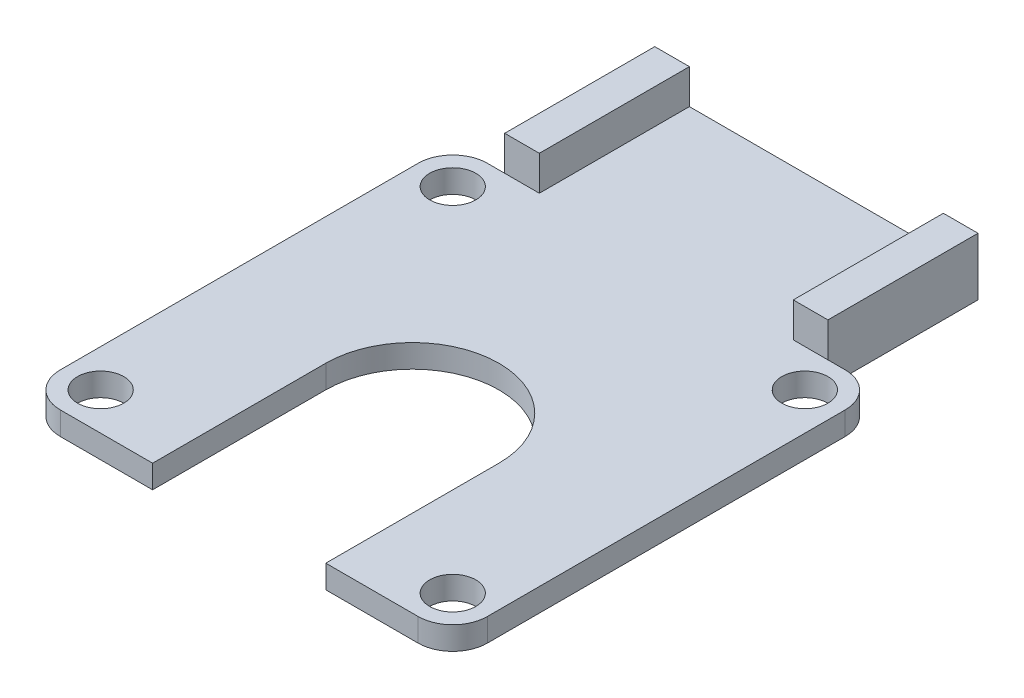
ISO-10303-21;
HEADER;
FILE_DESCRIPTION(('STEP AP214'),'2;1');
FILE_NAME('part.step','',(''),(''),'','','');
FILE_SCHEMA(('AUTOMOTIVE_DESIGN { 1 0 10303 214 1 1 1 1 }'));
ENDSEC;
DATA;
#1=APPLICATION_CONTEXT('core data for automotive mechanical design processes');
#2=APPLICATION_PROTOCOL_DEFINITION('international standard','automotive_design',2000,#1);
#3=PRODUCT_CONTEXT('',#1,'mechanical');
#4=PRODUCT('Part','Part','',(#3));
#5=PRODUCT_RELATED_PRODUCT_CATEGORY('part','',(#4));
#6=PRODUCT_DEFINITION_FORMATION('','',#4);
#7=PRODUCT_DEFINITION_CONTEXT('part definition',#1,'design');
#8=PRODUCT_DEFINITION('design','',#6,#7);
#9=PRODUCT_DEFINITION_SHAPE('','',#8);
#10=(LENGTH_UNIT() NAMED_UNIT(*) SI_UNIT(.MILLI.,.METRE.));
#11=(NAMED_UNIT(*) PLANE_ANGLE_UNIT() SI_UNIT($,.RADIAN.));
#12=(NAMED_UNIT(*) SI_UNIT($,.STERADIAN.) SOLID_ANGLE_UNIT());
#13=UNCERTAINTY_MEASURE_WITH_UNIT(LENGTH_MEASURE(1.E-05),#10,'distance_accuracy_value','');
#14=(GEOMETRIC_REPRESENTATION_CONTEXT(3) GLOBAL_UNCERTAINTY_ASSIGNED_CONTEXT((#13)) GLOBAL_UNIT_ASSIGNED_CONTEXT((#10,
#11,#12)) REPRESENTATION_CONTEXT('',''));
#15=CARTESIAN_POINT('',(0.,0.,0.));
#16=DIRECTION('',(0.,0.,1.));
#17=DIRECTION('',(1.,0.,0.));
#18=AXIS2_PLACEMENT_3D('',#15,#16,#17);
#19=CARTESIAN_POINT('',(0.,2.,0.));
#20=DIRECTION('',(0.,1.,0.));
#21=DIRECTION('',(0.,0.,1.));
#22=AXIS2_PLACEMENT_3D('',#19,#20,#21);
#23=PLANE('',#22);
#24=CARTESIAN_POINT('',(-15.25,2.,-15.25));
#25=DIRECTION('',(0.,1.,0.));
#26=DIRECTION('',(0.,0.,1.));
#27=AXIS2_PLACEMENT_3D('',#24,#25,#26);
#28=CIRCLE('',#27,2.);
#29=CARTESIAN_POINT('',(-15.25,2.,-13.25));
#30=VERTEX_POINT('',#29);
#31=EDGE_CURVE('E271',#30,#30,#28,.T.);
#32=ORIENTED_EDGE('',*,*,#31,.F.);
#33=EDGE_LOOP('',(#32));
#34=FACE_BOUND('',#33,.T.);
#35=CARTESIAN_POINT('',(15.25,2.,15.25));
#36=DIRECTION('',(0.,1.,0.));
#37=DIRECTION('',(0.,0.,1.));
#38=AXIS2_PLACEMENT_3D('',#35,#36,#37);
#39=CIRCLE('',#38,2.);
#40=CARTESIAN_POINT('',(15.25,2.,17.25));
#41=VERTEX_POINT('',#40);
#42=EDGE_CURVE('E283',#41,#41,#39,.T.);
#43=ORIENTED_EDGE('',*,*,#42,.F.);
#44=EDGE_LOOP('',(#43));
#45=FACE_BOUND('',#44,.T.);
#46=CARTESIAN_POINT('',(15.25,2.,-15.25));
#47=DIRECTION('',(0.,1.,0.));
#48=DIRECTION('',(0.,0.,1.));
#49=AXIS2_PLACEMENT_3D('',#46,#47,#48);
#50=CIRCLE('',#49,2.);
#51=CARTESIAN_POINT('',(15.25,2.,-13.25));
#52=VERTEX_POINT('',#51);
#53=EDGE_CURVE('E289',#52,#52,#50,.T.);
#54=ORIENTED_EDGE('',*,*,#53,.F.);
#55=EDGE_LOOP('',(#54));
#56=FACE_BOUND('',#55,.T.);
#57=CARTESIAN_POINT('',(-15.25,2.,15.25));
#58=DIRECTION('',(0.,1.,0.));
#59=DIRECTION('',(0.,0.,1.));
#60=AXIS2_PLACEMENT_3D('',#57,#58,#59);
#61=CIRCLE('',#60,2.);
#62=CARTESIAN_POINT('',(-15.25,2.,17.25));
#63=VERTEX_POINT('',#62);
#64=EDGE_CURVE('E295',#63,#63,#61,.T.);
#65=ORIENTED_EDGE('',*,*,#64,.F.);
#66=EDGE_LOOP('',(#65));
#67=FACE_BOUND('',#66,.T.);
#68=CARTESIAN_POINT('',(0.,2.,3.5));
#69=DIRECTION('',(0.,1.,0.));
#70=DIRECTION('',(0.,0.,1.));
#71=AXIS2_PLACEMENT_3D('',#68,#69,#70);
#72=CIRCLE('',#71,7.5);
#73=CARTESIAN_POINT('',(7.5,2.,3.5));
#74=VERTEX_POINT('',#73);
#75=CARTESIAN_POINT('',(-7.5,2.,3.5));
#76=VERTEX_POINT('',#75);
#77=EDGE_CURVE('E184',#74,#76,#72,.T.);
#78=ORIENTED_EDGE('',*,*,#77,.F.);
#79=DIRECTION('',(0.,0.,1.));
#80=VECTOR('',#79,1.);
#81=CARTESIAN_POINT('',(7.5,2.,0.));
#82=LINE('',#81,#80);
#83=CARTESIAN_POINT('',(7.5,2.,18.5));
#84=VERTEX_POINT('',#83);
#85=EDGE_CURVE('E196',#74,#84,#82,.T.);
#86=ORIENTED_EDGE('',*,*,#85,.T.);
#87=DIRECTION('',(1.,0.,0.));
#88=VECTOR('',#87,1.);
#89=CARTESIAN_POINT('',(18.5,2.,18.5));
#90=LINE('',#89,#88);
#91=CARTESIAN_POINT('',(15.5,2.,18.5));
#92=VERTEX_POINT('',#91);
#93=EDGE_CURVE('E305',#84,#92,#90,.T.);
#94=ORIENTED_EDGE('',*,*,#93,.T.);
#95=CARTESIAN_POINT('',(15.5,2.,15.5));
#96=DIRECTION('',(0.,1.,0.));
#97=DIRECTION('',(0.,0.,1.));
#98=AXIS2_PLACEMENT_3D('',#95,#96,#97);
#99=CIRCLE('',#98,3.);
#100=CARTESIAN_POINT('',(18.5,2.,15.5));
#101=VERTEX_POINT('',#100);
#102=EDGE_CURVE('E349',#92,#101,#99,.T.);
#103=ORIENTED_EDGE('',*,*,#102,.T.);
#104=DIRECTION('',(0.,0.,-1.));
#105=VECTOR('',#104,1.);
#106=CARTESIAN_POINT('',(18.5,2.,18.5));
#107=LINE('',#106,#105);
#108=CARTESIAN_POINT('',(18.5,2.,-15.5));
#109=VERTEX_POINT('',#108);
#110=EDGE_CURVE('E310',#101,#109,#107,.T.);
#111=ORIENTED_EDGE('',*,*,#110,.T.);
#112=CARTESIAN_POINT('',(15.5,2.,-15.5));
#113=DIRECTION('',(0.,1.,0.));
#114=DIRECTION('',(0.,0.,1.));
#115=AXIS2_PLACEMENT_3D('',#112,#113,#114);
#116=CIRCLE('',#115,3.);
#117=CARTESIAN_POINT('',(15.5,2.,-18.5));
#118=VERTEX_POINT('',#117);
#119=EDGE_CURVE('E351',#109,#118,#116,.T.);
#120=ORIENTED_EDGE('',*,*,#119,.T.);
#121=DIRECTION('',(-1.,0.,0.));
#122=VECTOR('',#121,1.);
#123=CARTESIAN_POINT('',(18.5,2.,-18.5));
#124=LINE('',#123,#122);
#125=CARTESIAN_POINT('',(14.,2.,-18.5));
#126=VERTEX_POINT('',#125);
#127=EDGE_CURVE('E314',#118,#126,#124,.T.);
#128=ORIENTED_EDGE('',*,*,#127,.T.);
#129=DIRECTION('',(1.,0.,0.));
#130=VECTOR('',#129,1.);
#131=CARTESIAN_POINT('',(14.,2.,-18.5));
#132=LINE('',#131,#130);
#133=CARTESIAN_POINT('',(11.,2.,-18.5));
#134=VERTEX_POINT('',#133);
#135=EDGE_CURVE('E56',#134,#126,#132,.T.);
#136=ORIENTED_EDGE('',*,*,#135,.F.);
#137=DIRECTION('',(0.,0.,1.));
#138=VECTOR('',#137,1.);
#139=CARTESIAN_POINT('',(11.,2.,-31.5));
#140=LINE('',#139,#138);
#141=CARTESIAN_POINT('',(11.,2.,-31.5));
#142=VERTEX_POINT('',#141);
#143=EDGE_CURVE('E207',#142,#134,#140,.T.);
#144=ORIENTED_EDGE('',*,*,#143,.F.);
#145=DIRECTION('',(-1.,0.,0.));
#146=VECTOR('',#145,1.);
#147=CARTESIAN_POINT('',(14.,2.,-31.5));
#148=LINE('',#147,#146);
#149=CARTESIAN_POINT('',(-11.,2.,-31.5));
#150=VERTEX_POINT('',#149);
#151=EDGE_CURVE('E257',#142,#150,#148,.T.);
#152=ORIENTED_EDGE('',*,*,#151,.T.);
#153=DIRECTION('',(0.,0.,-1.));
#154=VECTOR('',#153,1.);
#155=CARTESIAN_POINT('',(-11.,2.,-31.5));
#156=LINE('',#155,#154);
#157=CARTESIAN_POINT('',(-11.,2.,-18.5));
#158=VERTEX_POINT('',#157);
#159=EDGE_CURVE('E237',#158,#150,#156,.T.);
#160=ORIENTED_EDGE('',*,*,#159,.F.);
#161=DIRECTION('',(1.,0.,0.));
#162=VECTOR('',#161,1.);
#163=CARTESIAN_POINT('',(-14.,2.,-18.5));
#164=LINE('',#163,#162);
#165=CARTESIAN_POINT('',(-14.,2.,-18.5));
#166=VERTEX_POINT('',#165);
#167=EDGE_CURVE('E232',#166,#158,#164,.T.);
#168=ORIENTED_EDGE('',*,*,#167,.F.);
#169=CARTESIAN_POINT('',(-15.5,2.,-18.5));
#170=VERTEX_POINT('',#169);
#171=EDGE_CURVE('E313',#166,#170,#124,.T.);
#172=ORIENTED_EDGE('',*,*,#171,.T.);
#173=CARTESIAN_POINT('',(-15.5,2.,-15.5));
#174=DIRECTION('',(0.,1.,0.));
#175=DIRECTION('',(0.,0.,1.));
#176=AXIS2_PLACEMENT_3D('',#173,#174,#175);
#177=CIRCLE('',#176,3.);
#178=CARTESIAN_POINT('',(-18.5,2.,-15.5));
#179=VERTEX_POINT('',#178);
#180=EDGE_CURVE('E353',#170,#179,#177,.T.);
#181=ORIENTED_EDGE('',*,*,#180,.T.);
#182=DIRECTION('',(0.,0.,1.));
#183=VECTOR('',#182,1.);
#184=CARTESIAN_POINT('',(-18.5,2.,18.5));
#185=LINE('',#184,#183);
#186=CARTESIAN_POINT('',(-18.5,2.,15.5));
#187=VERTEX_POINT('',#186);
#188=EDGE_CURVE('E302',#179,#187,#185,.T.);
#189=ORIENTED_EDGE('',*,*,#188,.T.);
#190=CARTESIAN_POINT('',(-15.5,2.,15.5));
#191=DIRECTION('',(0.,1.,0.));
#192=DIRECTION('',(0.,0.,1.));
#193=AXIS2_PLACEMENT_3D('',#190,#191,#192);
#194=CIRCLE('',#193,3.);
#195=CARTESIAN_POINT('',(-15.5,2.,18.5));
#196=VERTEX_POINT('',#195);
#197=EDGE_CURVE('E347',#187,#196,#194,.T.);
#198=ORIENTED_EDGE('',*,*,#197,.T.);
#199=CARTESIAN_POINT('',(-7.5,2.,18.5));
#200=VERTEX_POINT('',#199);
#201=EDGE_CURVE('E307',#196,#200,#90,.T.);
#202=ORIENTED_EDGE('',*,*,#201,.T.);
#203=DIRECTION('',(0.,0.,1.));
#204=VECTOR('',#203,1.);
#205=CARTESIAN_POINT('',(-7.50000000000001,2.,0.));
#206=LINE('',#205,#204);
#207=EDGE_CURVE('E199',#76,#200,#206,.T.);
#208=ORIENTED_EDGE('',*,*,#207,.F.);
#209=EDGE_LOOP('',(#78,#86,#94,#103,#111,#120,#128,#136,#144,#152,#160,#168,#172,#181,#189,#198,
#202,#208));
#210=FACE_BOUND('',#209,.T.);
#211=ADVANCED_FACE('F33',(#34,#45,#56,#67,#210),#23,.T.);
#212=CARTESIAN_POINT('',(18.5,2.,18.5));
#213=DIRECTION('',(0.,0.,-1.));
#214=DIRECTION('',(-1.,0.,0.));
#215=AXIS2_PLACEMENT_3D('',#212,#213,#214);
#216=PLANE('',#215);
#217=DIRECTION('',(0.,1.,0.));
#218=VECTOR('',#217,1.);
#219=CARTESIAN_POINT('',(7.5,0.,18.5));
#220=LINE('',#219,#218);
#221=CARTESIAN_POINT('',(7.5,0.,18.5));
#222=VERTEX_POINT('',#221);
#223=EDGE_CURVE('E208',#222,#84,#220,.T.);
#224=ORIENTED_EDGE('',*,*,#223,.F.);
#225=DIRECTION('',(1.,0.,0.));
#226=VECTOR('',#225,1.);
#227=CARTESIAN_POINT('',(18.5,0.,18.5));
#228=LINE('',#227,#226);
#229=CARTESIAN_POINT('',(15.5,0.,18.5));
#230=VERTEX_POINT('',#229);
#231=EDGE_CURVE('E319',#222,#230,#228,.T.);
#232=ORIENTED_EDGE('',*,*,#231,.T.);
#233=DIRECTION('',(0.,-1.,0.));
#234=VECTOR('',#233,1.);
#235=CARTESIAN_POINT('',(15.5,2.,18.5));
#236=LINE('',#235,#234);
#237=EDGE_CURVE('E11',#230,#92,#236,.F.);
#238=ORIENTED_EDGE('',*,*,#237,.T.);
#239=ORIENTED_EDGE('',*,*,#93,.F.);
#240=EDGE_LOOP('',(#224,#232,#238,#239));
#241=FACE_BOUND('',#240,.T.);
#242=ADVANCED_FACE('F431',(#241),#216,.F.);
#243=CARTESIAN_POINT('',(0.,0.,0.));
#244=DIRECTION('',(0.,1.,0.));
#245=DIRECTION('',(0.,0.,1.));
#246=AXIS2_PLACEMENT_3D('',#243,#244,#245);
#247=PLANE('',#246);
#248=CARTESIAN_POINT('',(-15.25,0.,15.25));
#249=DIRECTION('',(0.,1.,0.));
#250=DIRECTION('',(0.,0.,1.));
#251=AXIS2_PLACEMENT_3D('',#248,#249,#250);
#252=CIRCLE('',#251,2.);
#253=CARTESIAN_POINT('',(-15.25,0.,17.25));
#254=VERTEX_POINT('',#253);
#255=EDGE_CURVE('E298',#254,#254,#252,.T.);
#256=ORIENTED_EDGE('',*,*,#255,.T.);
#257=EDGE_LOOP('',(#256));
#258=FACE_BOUND('',#257,.T.);
#259=CARTESIAN_POINT('',(15.25,0.,-15.25));
#260=DIRECTION('',(0.,1.,0.));
#261=DIRECTION('',(0.,0.,1.));
#262=AXIS2_PLACEMENT_3D('',#259,#260,#261);
#263=CIRCLE('',#262,2.);
#264=CARTESIAN_POINT('',(15.25,0.,-13.25));
#265=VERTEX_POINT('',#264);
#266=EDGE_CURVE('E292',#265,#265,#263,.T.);
#267=ORIENTED_EDGE('',*,*,#266,.T.);
#268=EDGE_LOOP('',(#267));
#269=FACE_BOUND('',#268,.T.);
#270=CARTESIAN_POINT('',(15.25,0.,15.25));
#271=DIRECTION('',(0.,1.,0.));
#272=DIRECTION('',(0.,0.,1.));
#273=AXIS2_PLACEMENT_3D('',#270,#271,#272);
#274=CIRCLE('',#273,2.);
#275=CARTESIAN_POINT('',(15.25,0.,17.25));
#276=VERTEX_POINT('',#275);
#277=EDGE_CURVE('E286',#276,#276,#274,.T.);
#278=ORIENTED_EDGE('',*,*,#277,.T.);
#279=EDGE_LOOP('',(#278));
#280=FACE_BOUND('',#279,.T.);
#281=CARTESIAN_POINT('',(-15.25,0.,-15.25));
#282=DIRECTION('',(0.,1.,0.));
#283=DIRECTION('',(0.,0.,1.));
#284=AXIS2_PLACEMENT_3D('',#281,#282,#283);
#285=CIRCLE('',#284,2.);
#286=CARTESIAN_POINT('',(-15.25,0.,-13.25));
#287=VERTEX_POINT('',#286);
#288=EDGE_CURVE('E280',#287,#287,#285,.T.);
#289=ORIENTED_EDGE('',*,*,#288,.T.);
#290=EDGE_LOOP('',(#289));
#291=FACE_BOUND('',#290,.T.);
#292=DIRECTION('',(0.,0.,1.));
#293=VECTOR('',#292,1.);
#294=CARTESIAN_POINT('',(7.5,0.,0.));
#295=LINE('',#294,#293);
#296=CARTESIAN_POINT('',(7.5,0.,3.5));
#297=VERTEX_POINT('',#296);
#298=EDGE_CURVE('E186',#297,#222,#295,.T.);
#299=ORIENTED_EDGE('',*,*,#298,.F.);
#300=CARTESIAN_POINT('',(0.,0.,3.5));
#301=DIRECTION('',(0.,1.,0.));
#302=DIRECTION('',(0.,0.,1.));
#303=AXIS2_PLACEMENT_3D('',#300,#301,#302);
#304=CIRCLE('',#303,7.5);
#305=CARTESIAN_POINT('',(-7.5,0.,3.5));
#306=VERTEX_POINT('',#305);
#307=EDGE_CURVE('E181',#297,#306,#304,.T.);
#308=ORIENTED_EDGE('',*,*,#307,.T.);
#309=DIRECTION('',(0.,0.,1.));
#310=VECTOR('',#309,1.);
#311=CARTESIAN_POINT('',(-7.50000000000001,0.,0.));
#312=LINE('',#311,#310);
#313=CARTESIAN_POINT('',(-7.5,0.,18.5));
#314=VERTEX_POINT('',#313);
#315=EDGE_CURVE('E188',#306,#314,#312,.T.);
#316=ORIENTED_EDGE('',*,*,#315,.T.);
#317=CARTESIAN_POINT('',(-15.5,0.,18.5));
#318=VERTEX_POINT('',#317);
#319=EDGE_CURVE('E320',#318,#314,#228,.T.);
#320=ORIENTED_EDGE('',*,*,#319,.F.);
#321=CARTESIAN_POINT('',(-15.5,0.,15.5));
#322=DIRECTION('',(0.,1.,0.));
#323=DIRECTION('',(0.,0.,1.));
#324=AXIS2_PLACEMENT_3D('',#321,#322,#323);
#325=CIRCLE('',#324,3.);
#326=CARTESIAN_POINT('',(-18.5,0.,15.5));
#327=VERTEX_POINT('',#326);
#328=EDGE_CURVE('E331',#318,#327,#325,.F.);
#329=ORIENTED_EDGE('',*,*,#328,.T.);
#330=DIRECTION('',(0.,0.,1.));
#331=VECTOR('',#330,1.);
#332=CARTESIAN_POINT('',(-18.5,0.,18.5));
#333=LINE('',#332,#331);
#334=CARTESIAN_POINT('',(-18.5,0.,-15.5));
#335=VERTEX_POINT('',#334);
#336=EDGE_CURVE('E301',#335,#327,#333,.T.);
#337=ORIENTED_EDGE('',*,*,#336,.F.);
#338=CARTESIAN_POINT('',(-15.5,0.,-15.5));
#339=DIRECTION('',(0.,1.,0.));
#340=DIRECTION('',(0.,0.,1.));
#341=AXIS2_PLACEMENT_3D('',#338,#339,#340);
#342=CIRCLE('',#341,3.);
#343=CARTESIAN_POINT('',(-15.5,0.,-18.5));
#344=VERTEX_POINT('',#343);
#345=EDGE_CURVE('E338',#335,#344,#342,.F.);
#346=ORIENTED_EDGE('',*,*,#345,.T.);
#347=DIRECTION('',(-1.,0.,0.));
#348=VECTOR('',#347,1.);
#349=CARTESIAN_POINT('',(18.5,0.,-18.5));
#350=LINE('',#349,#348);
#351=CARTESIAN_POINT('',(-14.,0.,-18.5));
#352=VERTEX_POINT('',#351);
#353=EDGE_CURVE('E325',#352,#344,#350,.T.);
#354=ORIENTED_EDGE('',*,*,#353,.F.);
#355=DIRECTION('',(0.,0.,1.));
#356=VECTOR('',#355,1.);
#357=CARTESIAN_POINT('',(-14.,0.,-18.5));
#358=LINE('',#357,#356);
#359=CARTESIAN_POINT('',(-14.,0.,-31.5));
#360=VERTEX_POINT('',#359);
#361=EDGE_CURVE('E258',#360,#352,#358,.T.);
#362=ORIENTED_EDGE('',*,*,#361,.F.);
#363=DIRECTION('',(-1.,0.,0.));
#364=VECTOR('',#363,1.);
#365=CARTESIAN_POINT('',(14.,0.,-31.5));
#366=LINE('',#365,#364);
#367=CARTESIAN_POINT('',(14.,0.,-31.5));
#368=VERTEX_POINT('',#367);
#369=EDGE_CURVE('E264',#368,#360,#366,.T.);
#370=ORIENTED_EDGE('',*,*,#369,.F.);
#371=DIRECTION('',(0.,0.,-1.));
#372=VECTOR('',#371,1.);
#373=CARTESIAN_POINT('',(14.,0.,-18.5));
#374=LINE('',#373,#372);
#375=CARTESIAN_POINT('',(14.,0.,-18.5));
#376=VERTEX_POINT('',#375);
#377=EDGE_CURVE('E261',#376,#368,#374,.T.);
#378=ORIENTED_EDGE('',*,*,#377,.F.);
#379=CARTESIAN_POINT('',(15.5,0.,-18.5));
#380=VERTEX_POINT('',#379);
#381=EDGE_CURVE('E306',#380,#376,#350,.T.);
#382=ORIENTED_EDGE('',*,*,#381,.F.);
#383=CARTESIAN_POINT('',(15.5,0.,-15.5));
#384=DIRECTION('',(0.,1.,0.));
#385=DIRECTION('',(0.,0.,1.));
#386=AXIS2_PLACEMENT_3D('',#383,#384,#385);
#387=CIRCLE('',#386,3.);
#388=CARTESIAN_POINT('',(18.5,0.,-15.5));
#389=VERTEX_POINT('',#388);
#390=EDGE_CURVE('E336',#380,#389,#387,.F.);
#391=ORIENTED_EDGE('',*,*,#390,.T.);
#392=DIRECTION('',(0.,0.,-1.));
#393=VECTOR('',#392,1.);
#394=CARTESIAN_POINT('',(18.5,0.,18.5));
#395=LINE('',#394,#393);
#396=CARTESIAN_POINT('',(18.5,0.,15.5));
#397=VERTEX_POINT('',#396);
#398=EDGE_CURVE('E322',#397,#389,#395,.T.);
#399=ORIENTED_EDGE('',*,*,#398,.F.);
#400=CARTESIAN_POINT('',(15.5,0.,15.5));
#401=DIRECTION('',(0.,1.,0.));
#402=DIRECTION('',(0.,0.,1.));
#403=AXIS2_PLACEMENT_3D('',#400,#401,#402);
#404=CIRCLE('',#403,3.);
#405=EDGE_CURVE('E333',#397,#230,#404,.F.);
#406=ORIENTED_EDGE('',*,*,#405,.T.);
#407=ORIENTED_EDGE('',*,*,#231,.F.);
#408=EDGE_LOOP('',(#299,#308,#316,#320,#329,#337,#346,#354,#362,#370,#378,#382,#391,#399,#406,#407));
#409=FACE_BOUND('',#408,.T.);
#410=ADVANCED_FACE('F194',(#258,#269,#280,#291,#409),#247,.F.);
#411=CARTESIAN_POINT('',(18.5,2.,-18.5));
#412=DIRECTION('',(0.,0.,1.));
#413=DIRECTION('',(1.,0.,0.));
#414=AXIS2_PLACEMENT_3D('',#411,#412,#413);
#415=PLANE('',#414);
#416=ORIENTED_EDGE('',*,*,#171,.F.);
#417=DIRECTION('',(0.,1.,0.));
#418=VECTOR('',#417,1.);
#419=CARTESIAN_POINT('',(-14.,0.,-18.5));
#420=LINE('',#419,#418);
#421=EDGE_CURVE('E267',#352,#166,#420,.T.);
#422=ORIENTED_EDGE('',*,*,#421,.F.);
#423=ORIENTED_EDGE('',*,*,#353,.T.);
#424=DIRECTION('',(0.,-1.,0.));
#425=VECTOR('',#424,1.);
#426=CARTESIAN_POINT('',(-15.5,2.,-18.5));
#427=LINE('',#426,#425);
#428=EDGE_CURVE('E344',#344,#170,#427,.F.);
#429=ORIENTED_EDGE('',*,*,#428,.T.);
#430=EDGE_LOOP('',(#416,#422,#423,#429));
#431=FACE_BOUND('',#430,.T.);
#432=ADVANCED_FACE('F381',(#431),#415,.F.);
#433=CARTESIAN_POINT('',(-18.5,2.,18.5));
#434=DIRECTION('',(1.,0.,0.));
#435=DIRECTION('',(0.,0.,-1.));
#436=AXIS2_PLACEMENT_3D('',#433,#434,#435);
#437=PLANE('',#436);
#438=ORIENTED_EDGE('',*,*,#188,.F.);
#439=DIRECTION('',(0.,-1.,0.));
#440=VECTOR('',#439,1.);
#441=CARTESIAN_POINT('',(-18.5,2.,-15.5));
#442=LINE('',#441,#440);
#443=EDGE_CURVE('E328',#179,#335,#442,.T.);
#444=ORIENTED_EDGE('',*,*,#443,.T.);
#445=ORIENTED_EDGE('',*,*,#336,.T.);
#446=DIRECTION('',(0.,-1.,0.));
#447=VECTOR('',#446,1.);
#448=CARTESIAN_POINT('',(-18.5,2.,15.5));
#449=LINE('',#448,#447);
#450=EDGE_CURVE('E316',#327,#187,#449,.F.);
#451=ORIENTED_EDGE('',*,*,#450,.T.);
#452=EDGE_LOOP('',(#438,#444,#445,#451));
#453=FACE_BOUND('',#452,.T.);
#454=ADVANCED_FACE('F370',(#453),#437,.F.);
#455=ORIENTED_EDGE('',*,*,#319,.T.);
#456=DIRECTION('',(0.,1.,0.));
#457=VECTOR('',#456,1.);
#458=CARTESIAN_POINT('',(-7.5,0.,18.5));
#459=LINE('',#458,#457);
#460=EDGE_CURVE('E48',#314,#200,#459,.T.);
#461=ORIENTED_EDGE('',*,*,#460,.T.);
#462=ORIENTED_EDGE('',*,*,#201,.F.);
#463=DIRECTION('',(0.,-1.,0.));
#464=VECTOR('',#463,1.);
#465=CARTESIAN_POINT('',(-15.5,2.,18.5));
#466=LINE('',#465,#464);
#467=EDGE_CURVE('E41',#196,#318,#466,.T.);
#468=ORIENTED_EDGE('',*,*,#467,.T.);
#469=EDGE_LOOP('',(#455,#461,#462,#468));
#470=FACE_BOUND('',#469,.T.);
#471=ADVANCED_FACE('F363',(#470),#216,.F.);
#472=CARTESIAN_POINT('',(18.5,2.,18.5));
#473=DIRECTION('',(-1.,0.,0.));
#474=DIRECTION('',(0.,0.,1.));
#475=AXIS2_PLACEMENT_3D('',#472,#473,#474);
#476=PLANE('',#475);
#477=ORIENTED_EDGE('',*,*,#398,.T.);
#478=DIRECTION('',(0.,-1.,0.));
#479=VECTOR('',#478,1.);
#480=CARTESIAN_POINT('',(18.5,2.,-15.5));
#481=LINE('',#480,#479);
#482=EDGE_CURVE('E358',#389,#109,#481,.F.);
#483=ORIENTED_EDGE('',*,*,#482,.T.);
#484=ORIENTED_EDGE('',*,*,#110,.F.);
#485=DIRECTION('',(0.,-1.,0.));
#486=VECTOR('',#485,1.);
#487=CARTESIAN_POINT('',(18.5,2.,15.5));
#488=LINE('',#487,#486);
#489=EDGE_CURVE('E355',#101,#397,#488,.T.);
#490=ORIENTED_EDGE('',*,*,#489,.T.);
#491=EDGE_LOOP('',(#477,#483,#484,#490));
#492=FACE_BOUND('',#491,.T.);
#493=ADVANCED_FACE('F422',(#492),#476,.F.);
#494=ORIENTED_EDGE('',*,*,#381,.T.);
#495=DIRECTION('',(0.,1.,0.));
#496=VECTOR('',#495,1.);
#497=CARTESIAN_POINT('',(14.,0.,-18.5));
#498=LINE('',#497,#496);
#499=EDGE_CURVE('E274',#376,#126,#498,.T.);
#500=ORIENTED_EDGE('',*,*,#499,.T.);
#501=ORIENTED_EDGE('',*,*,#127,.F.);
#502=DIRECTION('',(0.,-1.,0.));
#503=VECTOR('',#502,1.);
#504=CARTESIAN_POINT('',(15.5,2.,-18.5));
#505=LINE('',#504,#503);
#506=EDGE_CURVE('E341',#118,#380,#505,.T.);
#507=ORIENTED_EDGE('',*,*,#506,.T.);
#508=EDGE_LOOP('',(#494,#500,#501,#507));
#509=FACE_BOUND('',#508,.T.);
#510=ADVANCED_FACE('F413',(#509),#415,.F.);
#511=CARTESIAN_POINT('',(-15.5,2.,-15.5));
#512=DIRECTION('',(0.,-1.,0.));
#513=DIRECTION('',(0.,0.,-1.));
#514=AXIS2_PLACEMENT_3D('',#511,#512,#513);
#515=CYLINDRICAL_SURFACE('',#514,3.);
#516=ORIENTED_EDGE('',*,*,#180,.F.);
#517=ORIENTED_EDGE('',*,*,#428,.F.);
#518=ORIENTED_EDGE('',*,*,#345,.F.);
#519=ORIENTED_EDGE('',*,*,#443,.F.);
#520=EDGE_LOOP('',(#516,#517,#518,#519));
#521=FACE_BOUND('',#520,.T.);
#522=ADVANCED_FACE('F374',(#521),#515,.T.);
#523=CARTESIAN_POINT('',(15.5,2.,-15.5));
#524=DIRECTION('',(0.,-1.,0.));
#525=DIRECTION('',(0.,0.,-1.));
#526=AXIS2_PLACEMENT_3D('',#523,#524,#525);
#527=CYLINDRICAL_SURFACE('',#526,3.);
#528=ORIENTED_EDGE('',*,*,#119,.F.);
#529=ORIENTED_EDGE('',*,*,#482,.F.);
#530=ORIENTED_EDGE('',*,*,#390,.F.);
#531=ORIENTED_EDGE('',*,*,#506,.F.);
#532=EDGE_LOOP('',(#528,#529,#530,#531));
#533=FACE_BOUND('',#532,.T.);
#534=ADVANCED_FACE('F418',(#533),#527,.T.);
#535=CARTESIAN_POINT('',(15.5,2.,15.5));
#536=DIRECTION('',(0.,-1.,0.));
#537=DIRECTION('',(0.,0.,-1.));
#538=AXIS2_PLACEMENT_3D('',#535,#536,#537);
#539=CYLINDRICAL_SURFACE('',#538,3.);
#540=ORIENTED_EDGE('',*,*,#102,.F.);
#541=ORIENTED_EDGE('',*,*,#237,.F.);
#542=ORIENTED_EDGE('',*,*,#405,.F.);
#543=ORIENTED_EDGE('',*,*,#489,.F.);
#544=EDGE_LOOP('',(#540,#541,#542,#543));
#545=FACE_BOUND('',#544,.T.);
#546=ADVANCED_FACE('F428',(#545),#539,.T.);
#547=CARTESIAN_POINT('',(-15.5,2.,15.5));
#548=DIRECTION('',(0.,-1.,0.));
#549=DIRECTION('',(0.,0.,-1.));
#550=AXIS2_PLACEMENT_3D('',#547,#548,#549);
#551=CYLINDRICAL_SURFACE('',#550,3.);
#552=ORIENTED_EDGE('',*,*,#197,.F.);
#553=ORIENTED_EDGE('',*,*,#450,.F.);
#554=ORIENTED_EDGE('',*,*,#328,.F.);
#555=ORIENTED_EDGE('',*,*,#467,.F.);
#556=EDGE_LOOP('',(#552,#553,#554,#555));
#557=FACE_BOUND('',#556,.T.);
#558=ADVANCED_FACE('F35',(#557),#551,.T.);
#559=CARTESIAN_POINT('',(-15.25,2.,15.25));
#560=DIRECTION('',(0.,1.,0.));
#561=DIRECTION('',(0.,0.,1.));
#562=AXIS2_PLACEMENT_3D('',#559,#560,#561);
#563=CYLINDRICAL_SURFACE('',#562,2.);
#564=ORIENTED_EDGE('',*,*,#255,.F.);
#565=EDGE_LOOP('',(#564));
#566=FACE_BOUND('',#565,.T.);
#567=ORIENTED_EDGE('',*,*,#64,.T.);
#568=EDGE_LOOP('',(#567));
#569=FACE_BOUND('',#568,.T.);
#570=ADVANCED_FACE('F455',(#566,#569),#563,.F.);
#571=CARTESIAN_POINT('',(15.25,2.,-15.25));
#572=DIRECTION('',(0.,1.,0.));
#573=DIRECTION('',(0.,0.,1.));
#574=AXIS2_PLACEMENT_3D('',#571,#572,#573);
#575=CYLINDRICAL_SURFACE('',#574,2.);
#576=ORIENTED_EDGE('',*,*,#266,.F.);
#577=EDGE_LOOP('',(#576));
#578=FACE_BOUND('',#577,.T.);
#579=ORIENTED_EDGE('',*,*,#53,.T.);
#580=EDGE_LOOP('',(#579));
#581=FACE_BOUND('',#580,.T.);
#582=ADVANCED_FACE('F477',(#578,#581),#575,.F.);
#583=CARTESIAN_POINT('',(15.25,2.,15.25));
#584=DIRECTION('',(0.,1.,0.));
#585=DIRECTION('',(0.,0.,1.));
#586=AXIS2_PLACEMENT_3D('',#583,#584,#585);
#587=CYLINDRICAL_SURFACE('',#586,2.);
#588=ORIENTED_EDGE('',*,*,#277,.F.);
#589=EDGE_LOOP('',(#588));
#590=FACE_BOUND('',#589,.T.);
#591=ORIENTED_EDGE('',*,*,#42,.T.);
#592=EDGE_LOOP('',(#591));
#593=FACE_BOUND('',#592,.T.);
#594=ADVANCED_FACE('F482',(#590,#593),#587,.F.);
#595=CARTESIAN_POINT('',(-15.25,2.,-15.25));
#596=DIRECTION('',(0.,1.,0.));
#597=DIRECTION('',(0.,0.,1.));
#598=AXIS2_PLACEMENT_3D('',#595,#596,#597);
#599=CYLINDRICAL_SURFACE('',#598,2.);
#600=ORIENTED_EDGE('',*,*,#288,.F.);
#601=EDGE_LOOP('',(#600));
#602=FACE_BOUND('',#601,.T.);
#603=ORIENTED_EDGE('',*,*,#31,.T.);
#604=EDGE_LOOP('',(#603));
#605=FACE_BOUND('',#604,.T.);
#606=ADVANCED_FACE('F495',(#602,#605),#599,.F.);
#607=CARTESIAN_POINT('',(-14.,0.,-18.5));
#608=DIRECTION('',(-1.,0.,0.));
#609=DIRECTION('',(0.,0.,1.));
#610=AXIS2_PLACEMENT_3D('',#607,#608,#609);
#611=PLANE('',#610);
#612=ORIENTED_EDGE('',*,*,#421,.T.);
#613=DIRECTION('',(0.,-1.,0.));
#614=VECTOR('',#613,1.);
#615=CARTESIAN_POINT('',(-14.,5.,-18.5));
#616=LINE('',#615,#614);
#617=CARTESIAN_POINT('',(-14.,5.,-18.5));
#618=VERTEX_POINT('',#617);
#619=EDGE_CURVE('E254',#618,#166,#616,.T.);
#620=ORIENTED_EDGE('',*,*,#619,.F.);
#621=DIRECTION('',(0.,0.,1.));
#622=VECTOR('',#621,1.);
#623=CARTESIAN_POINT('',(-14.,5.,-31.5));
#624=LINE('',#623,#622);
#625=CARTESIAN_POINT('',(-14.,5.,-31.5));
#626=VERTEX_POINT('',#625);
#627=EDGE_CURVE('E233',#626,#618,#624,.T.);
#628=ORIENTED_EDGE('',*,*,#627,.F.);
#629=DIRECTION('',(0.,1.,0.));
#630=VECTOR('',#629,1.);
#631=CARTESIAN_POINT('',(-14.,0.,-31.5));
#632=LINE('',#631,#630);
#633=EDGE_CURVE('E269',#360,#626,#632,.T.);
#634=ORIENTED_EDGE('',*,*,#633,.F.);
#635=ORIENTED_EDGE('',*,*,#361,.T.);
#636=EDGE_LOOP('',(#612,#620,#628,#634,#635));
#637=FACE_BOUND('',#636,.T.);
#638=ADVANCED_FACE('F384',(#637),#611,.T.);
#639=CARTESIAN_POINT('',(14.,0.,-31.5));
#640=DIRECTION('',(0.,0.,-1.));
#641=DIRECTION('',(-1.,0.,0.));
#642=AXIS2_PLACEMENT_3D('',#639,#640,#641);
#643=PLANE('',#642);
#644=ORIENTED_EDGE('',*,*,#151,.F.);
#645=DIRECTION('',(0.,-1.,0.));
#646=VECTOR('',#645,1.);
#647=CARTESIAN_POINT('',(11.,5.,-31.5));
#648=LINE('',#647,#646);
#649=CARTESIAN_POINT('',(11.,5.,-31.5));
#650=VERTEX_POINT('',#649);
#651=EDGE_CURVE('E229',#650,#142,#648,.T.);
#652=ORIENTED_EDGE('',*,*,#651,.F.);
#653=DIRECTION('',(-1.,0.,0.));
#654=VECTOR('',#653,1.);
#655=CARTESIAN_POINT('',(14.,5.,-31.5));
#656=LINE('',#655,#654);
#657=CARTESIAN_POINT('',(14.,5.,-31.5));
#658=VERTEX_POINT('',#657);
#659=EDGE_CURVE('E211',#658,#650,#656,.T.);
#660=ORIENTED_EDGE('',*,*,#659,.F.);
#661=DIRECTION('',(0.,1.,0.));
#662=VECTOR('',#661,1.);
#663=CARTESIAN_POINT('',(14.,0.,-31.5));
#664=LINE('',#663,#662);
#665=EDGE_CURVE('E272',#368,#658,#664,.T.);
#666=ORIENTED_EDGE('',*,*,#665,.F.);
#667=ORIENTED_EDGE('',*,*,#369,.T.);
#668=ORIENTED_EDGE('',*,*,#633,.T.);
#669=DIRECTION('',(-1.,0.,0.));
#670=VECTOR('',#669,1.);
#671=CARTESIAN_POINT('',(-14.,5.,-31.5));
#672=LINE('',#671,#670);
#673=CARTESIAN_POINT('',(-11.,5.,-31.5));
#674=VERTEX_POINT('',#673);
#675=EDGE_CURVE('E241',#674,#626,#672,.T.);
#676=ORIENTED_EDGE('',*,*,#675,.F.);
#677=DIRECTION('',(0.,-1.,0.));
#678=VECTOR('',#677,1.);
#679=CARTESIAN_POINT('',(-11.,5.,-31.5));
#680=LINE('',#679,#678);
#681=EDGE_CURVE('E244',#674,#150,#680,.T.);
#682=ORIENTED_EDGE('',*,*,#681,.T.);
#683=EDGE_LOOP('',(#644,#652,#660,#666,#667,#668,#676,#682));
#684=FACE_BOUND('',#683,.T.);
#685=ADVANCED_FACE('F389',(#684),#643,.T.);
#686=CARTESIAN_POINT('',(14.,0.,-18.5));
#687=DIRECTION('',(1.,0.,0.));
#688=DIRECTION('',(0.,0.,-1.));
#689=AXIS2_PLACEMENT_3D('',#686,#687,#688);
#690=PLANE('',#689);
#691=ORIENTED_EDGE('',*,*,#665,.T.);
#692=DIRECTION('',(0.,0.,-1.));
#693=VECTOR('',#692,1.);
#694=CARTESIAN_POINT('',(14.,5.,-31.5));
#695=LINE('',#694,#693);
#696=CARTESIAN_POINT('',(14.,5.,-18.5));
#697=VERTEX_POINT('',#696);
#698=EDGE_CURVE('E218',#697,#658,#695,.T.);
#699=ORIENTED_EDGE('',*,*,#698,.F.);
#700=DIRECTION('',(0.,-1.,0.));
#701=VECTOR('',#700,1.);
#702=CARTESIAN_POINT('',(14.,5.,-18.5));
#703=LINE('',#702,#701);
#704=EDGE_CURVE('E221',#697,#126,#703,.T.);
#705=ORIENTED_EDGE('',*,*,#704,.T.);
#706=ORIENTED_EDGE('',*,*,#499,.F.);
#707=ORIENTED_EDGE('',*,*,#377,.T.);
#708=EDGE_LOOP('',(#691,#699,#705,#706,#707));
#709=FACE_BOUND('',#708,.T.);
#710=ADVANCED_FACE('F409',(#709),#690,.T.);
#711=CARTESIAN_POINT('',(-14.,5.,-18.5));
#712=DIRECTION('',(0.,0.,-1.));
#713=DIRECTION('',(-1.,0.,0.));
#714=AXIS2_PLACEMENT_3D('',#711,#712,#713);
#715=PLANE('',#714);
#716=ORIENTED_EDGE('',*,*,#167,.T.);
#717=DIRECTION('',(0.,-1.,0.));
#718=VECTOR('',#717,1.);
#719=CARTESIAN_POINT('',(-11.,5.,-18.5));
#720=LINE('',#719,#718);
#721=CARTESIAN_POINT('',(-11.,5.,-18.5));
#722=VERTEX_POINT('',#721);
#723=EDGE_CURVE('E251',#722,#158,#720,.T.);
#724=ORIENTED_EDGE('',*,*,#723,.F.);
#725=DIRECTION('',(1.,0.,0.));
#726=VECTOR('',#725,1.);
#727=CARTESIAN_POINT('',(-14.,5.,-18.5));
#728=LINE('',#727,#726);
#729=EDGE_CURVE('E236',#618,#722,#728,.T.);
#730=ORIENTED_EDGE('',*,*,#729,.F.);
#731=ORIENTED_EDGE('',*,*,#619,.T.);
#732=EDGE_LOOP('',(#716,#724,#730,#731));
#733=FACE_BOUND('',#732,.T.);
#734=ADVANCED_FACE('F510',(#733),#715,.F.);
#735=CARTESIAN_POINT('',(-11.,5.,-31.5));
#736=DIRECTION('',(-1.,0.,0.));
#737=DIRECTION('',(0.,0.,1.));
#738=AXIS2_PLACEMENT_3D('',#735,#736,#737);
#739=PLANE('',#738);
#740=ORIENTED_EDGE('',*,*,#159,.T.);
#741=ORIENTED_EDGE('',*,*,#681,.F.);
#742=DIRECTION('',(0.,0.,-1.));
#743=VECTOR('',#742,1.);
#744=CARTESIAN_POINT('',(-11.,5.,-31.5));
#745=LINE('',#744,#743);
#746=EDGE_CURVE('E239',#722,#674,#745,.T.);
#747=ORIENTED_EDGE('',*,*,#746,.F.);
#748=ORIENTED_EDGE('',*,*,#723,.T.);
#749=EDGE_LOOP('',(#740,#741,#747,#748));
#750=FACE_BOUND('',#749,.T.);
#751=ADVANCED_FACE('F396',(#750),#739,.F.);
#752=CARTESIAN_POINT('',(0.,5.,0.));
#753=DIRECTION('',(0.,1.,0.));
#754=DIRECTION('',(0.,0.,1.));
#755=AXIS2_PLACEMENT_3D('',#752,#753,#754);
#756=PLANE('',#755);
#757=ORIENTED_EDGE('',*,*,#627,.T.);
#758=ORIENTED_EDGE('',*,*,#729,.T.);
#759=ORIENTED_EDGE('',*,*,#746,.T.);
#760=ORIENTED_EDGE('',*,*,#675,.T.);
#761=EDGE_LOOP('',(#757,#758,#759,#760));
#762=FACE_BOUND('',#761,.T.);
#763=ADVANCED_FACE('F391',(#762),#756,.T.);
#764=CARTESIAN_POINT('',(11.,5.,-31.5));
#765=DIRECTION('',(1.,0.,0.));
#766=DIRECTION('',(0.,0.,-1.));
#767=AXIS2_PLACEMENT_3D('',#764,#765,#766);
#768=PLANE('',#767);
#769=ORIENTED_EDGE('',*,*,#143,.T.);
#770=DIRECTION('',(0.,-1.,0.));
#771=VECTOR('',#770,1.);
#772=CARTESIAN_POINT('',(11.,5.,-18.5));
#773=LINE('',#772,#771);
#774=CARTESIAN_POINT('',(11.,5.,-18.5));
#775=VERTEX_POINT('',#774);
#776=EDGE_CURVE('E226',#775,#134,#773,.T.);
#777=ORIENTED_EDGE('',*,*,#776,.F.);
#778=DIRECTION('',(0.,0.,1.));
#779=VECTOR('',#778,1.);
#780=CARTESIAN_POINT('',(11.,5.,-31.5));
#781=LINE('',#780,#779);
#782=EDGE_CURVE('E214',#650,#775,#781,.T.);
#783=ORIENTED_EDGE('',*,*,#782,.F.);
#784=ORIENTED_EDGE('',*,*,#651,.T.);
#785=EDGE_LOOP('',(#769,#777,#783,#784));
#786=FACE_BOUND('',#785,.T.);
#787=ADVANCED_FACE('F400',(#786),#768,.F.);
#788=CARTESIAN_POINT('',(14.,5.,-18.5));
#789=DIRECTION('',(0.,0.,-1.));
#790=DIRECTION('',(-1.,0.,0.));
#791=AXIS2_PLACEMENT_3D('',#788,#789,#790);
#792=PLANE('',#791);
#793=ORIENTED_EDGE('',*,*,#135,.T.);
#794=ORIENTED_EDGE('',*,*,#704,.F.);
#795=DIRECTION('',(1.,0.,0.));
#796=VECTOR('',#795,1.);
#797=CARTESIAN_POINT('',(14.,5.,-18.5));
#798=LINE('',#797,#796);
#799=EDGE_CURVE('E216',#775,#697,#798,.T.);
#800=ORIENTED_EDGE('',*,*,#799,.F.);
#801=ORIENTED_EDGE('',*,*,#776,.T.);
#802=EDGE_LOOP('',(#793,#794,#800,#801));
#803=FACE_BOUND('',#802,.T.);
#804=ADVANCED_FACE('F522',(#803),#792,.F.);
#805=CARTESIAN_POINT('',(0.,5.,0.));
#806=DIRECTION('',(0.,1.,0.));
#807=DIRECTION('',(0.,0.,1.));
#808=AXIS2_PLACEMENT_3D('',#805,#806,#807);
#809=PLANE('',#808);
#810=ORIENTED_EDGE('',*,*,#659,.T.);
#811=ORIENTED_EDGE('',*,*,#782,.T.);
#812=ORIENTED_EDGE('',*,*,#799,.T.);
#813=ORIENTED_EDGE('',*,*,#698,.T.);
#814=EDGE_LOOP('',(#810,#811,#812,#813));
#815=FACE_BOUND('',#814,.T.);
#816=ADVANCED_FACE('F404',(#815),#809,.T.);
#817=CARTESIAN_POINT('',(0.,0.,3.5));
#818=DIRECTION('',(0.,1.,0.));
#819=DIRECTION('',(0.,0.,1.));
#820=AXIS2_PLACEMENT_3D('',#817,#818,#819);
#821=CYLINDRICAL_SURFACE('',#820,7.5);
#822=ORIENTED_EDGE('',*,*,#77,.T.);
#823=DIRECTION('',(0.,1.,0.));
#824=VECTOR('',#823,1.);
#825=CARTESIAN_POINT('',(-7.5,0.,3.5));
#826=LINE('',#825,#824);
#827=EDGE_CURVE('E178',#306,#76,#826,.T.);
#828=ORIENTED_EDGE('',*,*,#827,.F.);
#829=ORIENTED_EDGE('',*,*,#307,.F.);
#830=DIRECTION('',(0.,1.,0.));
#831=VECTOR('',#830,1.);
#832=CARTESIAN_POINT('',(7.5,0.,3.5));
#833=LINE('',#832,#831);
#834=EDGE_CURVE('E205',#297,#74,#833,.T.);
#835=ORIENTED_EDGE('',*,*,#834,.T.);
#836=EDGE_LOOP('',(#822,#828,#829,#835));
#837=FACE_BOUND('',#836,.T.);
#838=ADVANCED_FACE('F179',(#837),#821,.F.);
#839=CARTESIAN_POINT('',(7.5,0.,0.));
#840=DIRECTION('',(-1.,0.,0.));
#841=DIRECTION('',(0.,0.,1.));
#842=AXIS2_PLACEMENT_3D('',#839,#840,#841);
#843=PLANE('',#842);
#844=ORIENTED_EDGE('',*,*,#85,.F.);
#845=ORIENTED_EDGE('',*,*,#834,.F.);
#846=ORIENTED_EDGE('',*,*,#298,.T.);
#847=ORIENTED_EDGE('',*,*,#223,.T.);
#848=EDGE_LOOP('',(#844,#845,#846,#847));
#849=FACE_BOUND('',#848,.T.);
#850=ADVANCED_FACE('F434',(#849),#843,.T.);
#851=CARTESIAN_POINT('',(-7.50000000000001,0.,0.));
#852=DIRECTION('',(-1.,0.,0.));
#853=DIRECTION('',(0.,0.,1.));
#854=AXIS2_PLACEMENT_3D('',#851,#852,#853);
#855=PLANE('',#854);
#856=ORIENTED_EDGE('',*,*,#207,.T.);
#857=ORIENTED_EDGE('',*,*,#460,.F.);
#858=ORIENTED_EDGE('',*,*,#315,.F.);
#859=ORIENTED_EDGE('',*,*,#827,.T.);
#860=EDGE_LOOP('',(#856,#857,#858,#859));
#861=FACE_BOUND('',#860,.T.);
#862=ADVANCED_FACE('F189',(#861),#855,.F.);
#863=CLOSED_SHELL('',(#211,#242,#410,#432,#454,#471,#493,#510,#522,#534,#546,#558,#570,#582,
#594,#606,#638,#685,#710,#734,#751,#763,#787,#804,#816,#838,#850,#862));
#864=MANIFOLD_SOLID_BREP('B2',#863);
#865=ADVANCED_BREP_SHAPE_REPRESENTATION('',(#18,#864),#14);
#866=SHAPE_DEFINITION_REPRESENTATION(#9,#865);
ENDSEC;
END-ISO-10303-21;
